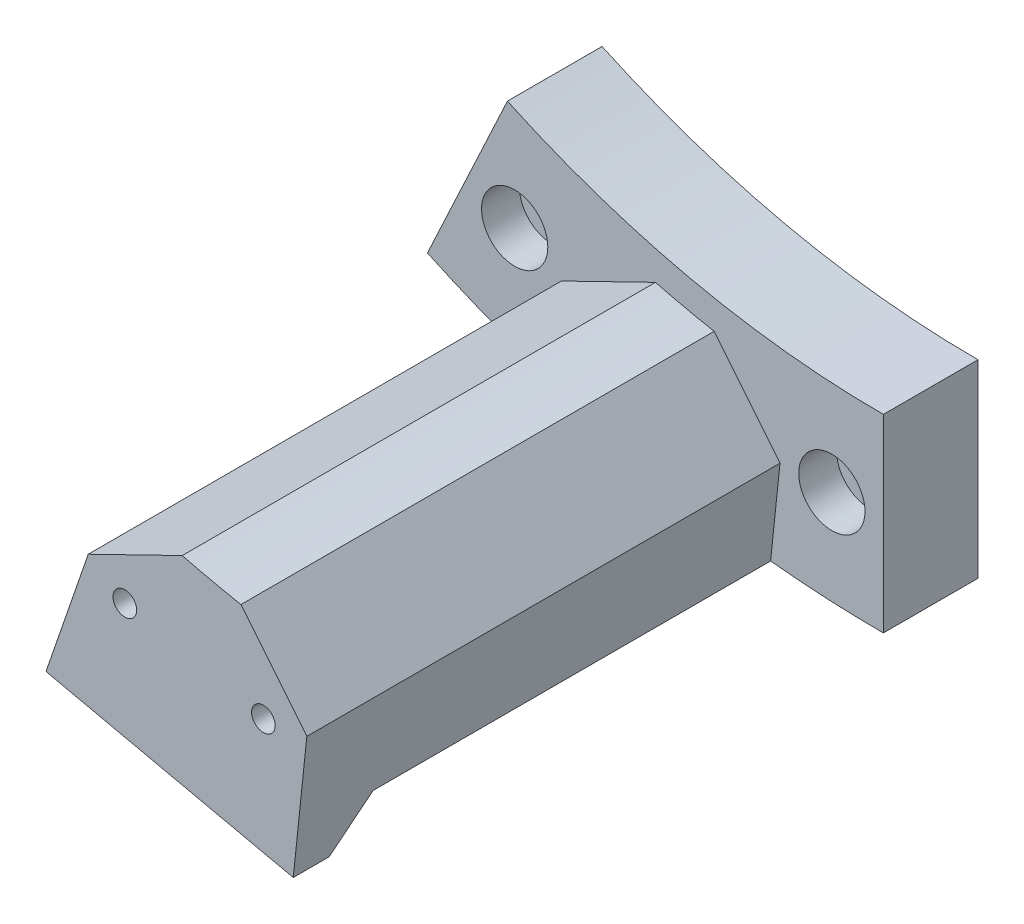
ISO-10303-21;
HEADER;
FILE_DESCRIPTION(('STEP AP214'),'2;1');
FILE_NAME('part.step','',(''),(''),'','','');
FILE_SCHEMA(('AUTOMOTIVE_DESIGN { 1 0 10303 214 1 1 1 1 }'));
ENDSEC;
DATA;
#1=APPLICATION_CONTEXT('core data for automotive mechanical design processes');
#2=APPLICATION_PROTOCOL_DEFINITION('international standard','automotive_design',2000,#1);
#3=PRODUCT_CONTEXT('',#1,'mechanical');
#4=PRODUCT('Part','Part','',(#3));
#5=PRODUCT_RELATED_PRODUCT_CATEGORY('part','',(#4));
#6=PRODUCT_DEFINITION_FORMATION('','',#4);
#7=PRODUCT_DEFINITION_CONTEXT('part definition',#1,'design');
#8=PRODUCT_DEFINITION('design','',#6,#7);
#9=PRODUCT_DEFINITION_SHAPE('','',#8);
#10=(LENGTH_UNIT() NAMED_UNIT(*) SI_UNIT(.MILLI.,.METRE.));
#11=(NAMED_UNIT(*) PLANE_ANGLE_UNIT() SI_UNIT($,.RADIAN.));
#12=(NAMED_UNIT(*) SI_UNIT($,.STERADIAN.) SOLID_ANGLE_UNIT());
#13=UNCERTAINTY_MEASURE_WITH_UNIT(LENGTH_MEASURE(1.E-05),#10,'distance_accuracy_value','');
#14=(GEOMETRIC_REPRESENTATION_CONTEXT(3) GLOBAL_UNCERTAINTY_ASSIGNED_CONTEXT((#13)) GLOBAL_UNIT_ASSIGNED_CONTEXT((#10,
#11,#12)) REPRESENTATION_CONTEXT('',''));
#15=CARTESIAN_POINT('',(0.,0.,0.));
#16=DIRECTION('',(0.,0.,1.));
#17=DIRECTION('',(1.,0.,0.));
#18=AXIS2_PLACEMENT_3D('',#15,#16,#17);
#19=CARTESIAN_POINT('',(-38.9590857152549,-96.4271208749459,-0.000999999999999265));
#20=DIRECTION('',(0.,0.,1.));
#21=DIRECTION('',(1.,0.,0.));
#22=AXIS2_PLACEMENT_3D('',#19,#20,#21);
#23=CYLINDRICAL_SURFACE('',#22,1.75);
#24=CARTESIAN_POINT('',(-38.9590857152549,-96.4271208749459,0.));
#25=DIRECTION('',(0.,0.,-1.));
#26=DIRECTION('',(-1.,0.,0.));
#27=AXIS2_PLACEMENT_3D('',#24,#25,#26);
#28=CIRCLE('',#27,1.75);
#29=CARTESIAN_POINT('',(-40.7090857152549,-96.4271208749459,0.));
#30=VERTEX_POINT('',#29);
#31=EDGE_CURVE('E287',#30,#30,#28,.F.);
#32=ORIENTED_EDGE('',*,*,#31,.F.);
#33=EDGE_LOOP('',(#32));
#34=FACE_BOUND('',#33,.T.);
#35=CARTESIAN_POINT('',(-38.9590857152549,-96.4271208749459,6.));
#36=DIRECTION('',(0.,0.,1.));
#37=DIRECTION('',(1.,0.,0.));
#38=AXIS2_PLACEMENT_3D('',#35,#36,#37);
#39=CIRCLE('',#38,1.75);
#40=CARTESIAN_POINT('',(-37.2090857152549,-96.4271208749459,6.));
#41=VERTEX_POINT('',#40);
#42=EDGE_CURVE('E289',#41,#41,#39,.F.);
#43=ORIENTED_EDGE('',*,*,#42,.F.);
#44=EDGE_LOOP('',(#43));
#45=FACE_BOUND('',#44,.T.);
#46=ADVANCED_FACE('F36',(#34,#45),#23,.F.);
#47=CARTESIAN_POINT('',(-5.44293944926615,-103.857471614476,-0.000999999999999265));
#48=DIRECTION('',(0.,0.,1.));
#49=DIRECTION('',(1.,0.,0.));
#50=AXIS2_PLACEMENT_3D('',#47,#48,#49);
#51=CYLINDRICAL_SURFACE('',#50,1.75);
#52=CARTESIAN_POINT('',(-5.44293944926615,-103.857471614476,0.));
#53=DIRECTION('',(0.,0.,-1.));
#54=DIRECTION('',(-1.,0.,0.));
#55=AXIS2_PLACEMENT_3D('',#52,#53,#54);
#56=CIRCLE('',#55,1.75);
#57=CARTESIAN_POINT('',(-7.19293944926615,-103.857471614476,0.));
#58=VERTEX_POINT('',#57);
#59=EDGE_CURVE('E284',#58,#58,#56,.F.);
#60=ORIENTED_EDGE('',*,*,#59,.F.);
#61=EDGE_LOOP('',(#60));
#62=FACE_BOUND('',#61,.T.);
#63=CARTESIAN_POINT('',(-5.44293944926615,-103.857471614476,6.));
#64=DIRECTION('',(0.,0.,1.));
#65=DIRECTION('',(1.,0.,0.));
#66=AXIS2_PLACEMENT_3D('',#63,#64,#65);
#67=CIRCLE('',#66,1.75);
#68=CARTESIAN_POINT('',(-3.69293944926615,-103.857471614476,6.));
#69=VERTEX_POINT('',#68);
#70=EDGE_CURVE('E273',#69,#69,#67,.F.);
#71=ORIENTED_EDGE('',*,*,#70,.F.);
#72=EDGE_LOOP('',(#71));
#73=FACE_BOUND('',#72,.T.);
#74=ADVANCED_FACE('F239',(#62,#73),#51,.F.);
#75=CARTESIAN_POINT('',(0.,0.,10.));
#76=DIRECTION('',(0.,0.,-1.));
#77=DIRECTION('',(-1.,0.,0.));
#78=AXIS2_PLACEMENT_3D('',#75,#76,#77);
#79=PLANE('',#78);
#80=CARTESIAN_POINT('',(-38.9590857152549,-96.4271208749459,10.));
#81=DIRECTION('',(0.,0.,1.));
#82=DIRECTION('',(1.,0.,0.));
#83=AXIS2_PLACEMENT_3D('',#80,#81,#82);
#84=CIRCLE('',#83,3.5);
#85=CARTESIAN_POINT('',(-35.4590857152549,-96.4271208749459,10.));
#86=VERTEX_POINT('',#85);
#87=EDGE_CURVE('E274',#86,#86,#84,.T.);
#88=ORIENTED_EDGE('',*,*,#87,.F.);
#89=EDGE_LOOP('',(#88));
#90=FACE_BOUND('',#89,.T.);
#91=CARTESIAN_POINT('',(-5.44293944926615,-103.857471614476,10.));
#92=DIRECTION('',(0.,0.,1.));
#93=DIRECTION('',(1.,0.,0.));
#94=AXIS2_PLACEMENT_3D('',#91,#92,#93);
#95=CIRCLE('',#94,3.5);
#96=CARTESIAN_POINT('',(-1.94293944926615,-103.857471614476,10.));
#97=VERTEX_POINT('',#96);
#98=EDGE_CURVE('E280',#97,#97,#95,.T.);
#99=ORIENTED_EDGE('',*,*,#98,.F.);
#100=EDGE_LOOP('',(#99));
#101=FACE_BOUND('',#100,.T.);
#102=DIRECTION('',(-0.325568154457157,-0.945518575599317,0.));
#103=VECTOR('',#102,1.);
#104=CARTESIAN_POINT('',(-31.5801109823442,-91.7153018331337,10.));
#105=LINE('',#104,#103);
#106=CARTESIAN_POINT('',(-34.0218721407729,-98.8066911501286,10.));
#107=VERTEX_POINT('',#106);
#108=CARTESIAN_POINT('',(-37.1147696081159,-107.789117618322,10.));
#109=VERTEX_POINT('',#108);
#110=EDGE_CURVE('E157',#107,#109,#105,.T.);
#111=ORIENTED_EDGE('',*,*,#110,.F.);
#112=DIRECTION('',(-0.898794046299167,-0.438371146789077,0.));
#113=VECTOR('',#112,1.);
#114=CARTESIAN_POINT('',(32.3924095046778,-66.4142816454508,10.));
#115=LINE('',#114,#113);
#116=CARTESIAN_POINT('',(-24.0878755883377,-93.961557296805,10.));
#117=VERTEX_POINT('',#116);
#118=EDGE_CURVE('E11',#107,#117,#115,.F.);
#119=ORIENTED_EDGE('',*,*,#118,.T.);
#120=CARTESIAN_POINT('',(0.,0.,10.));
#121=DIRECTION('',(0.,0.,-1.));
#122=DIRECTION('',(-1.,0.,0.));
#123=AXIS2_PLACEMENT_3D('',#120,#121,#122);
#124=CIRCLE('',#123,97.);
#125=CARTESIAN_POINT('',(-17.8788407963445,-95.3380671703542,10.));
#126=VERTEX_POINT('',#125);
#127=EDGE_CURVE('E154',#126,#117,#124,.T.);
#128=ORIENTED_EDGE('',*,*,#127,.F.);
#129=DIRECTION('',(-0.629320391049836,0.777145961456972,0.));
#130=VECTOR('',#129,1.);
#131=CARTESIAN_POINT('',(-57.4253812387272,-46.5021568272572,10.));
#132=LINE('',#131,#130);
#133=CARTESIAN_POINT('',(-10.9232244114698,-103.927538065985,10.));
#134=VERTEX_POINT('',#133);
#135=EDGE_CURVE('E45',#126,#134,#132,.F.);
#136=ORIENTED_EDGE('',*,*,#135,.T.);
#137=DIRECTION('',(0.104528463267654,0.994521895368273,0.));
#138=VECTOR('',#137,1.);
#139=CARTESIAN_POINT('',(-10.1392609369624,-96.4686238507225,10.));
#140=LINE('',#139,#138);
#141=CARTESIAN_POINT('',(-11.9162448125125,-113.375496071983,10.));
#142=VERTEX_POINT('',#141);
#143=EDGE_CURVE('E141',#142,#134,#140,.T.);
#144=ORIENTED_EDGE('',*,*,#143,.F.);
#145=CARTESIAN_POINT('',(0.,0.,10.));
#146=DIRECTION('',(0.,0.,1.));
#147=DIRECTION('',(-1.,0.,0.));
#148=AXIS2_PLACEMENT_3D('',#145,#146,#147);
#149=CIRCLE('',#148,114.);
#150=CARTESIAN_POINT('',(0.,-114.,10.));
#151=VERTEX_POINT('',#150);
#152=EDGE_CURVE('E169',#142,#151,#149,.T.);
#153=ORIENTED_EDGE('',*,*,#152,.T.);
#154=DIRECTION('',(0.,1.,0.));
#155=VECTOR('',#154,1.);
#156=CARTESIAN_POINT('',(0.,-94.,10.));
#157=LINE('',#156,#155);
#158=CARTESIAN_POINT('',(0.,-94.,10.));
#159=VERTEX_POINT('',#158);
#160=EDGE_CURVE('E168',#151,#159,#157,.T.);
#161=ORIENTED_EDGE('',*,*,#160,.T.);
#162=CARTESIAN_POINT('',(0.,0.,10.));
#163=DIRECTION('',(0.,0.,-1.));
#164=DIRECTION('',(-1.,0.,0.));
#165=AXIS2_PLACEMENT_3D('',#162,#163,#164);
#166=CIRCLE('',#165,94.);
#167=CARTESIAN_POINT('',(-39.7261166036258,-85.1929319814451,10.));
#168=VERTEX_POINT('',#167);
#169=EDGE_CURVE('E171',#159,#168,#166,.T.);
#170=ORIENTED_EDGE('',*,*,#169,.T.);
#171=DIRECTION('',(-0.4226182617407,-0.90630778703665,0.));
#172=VECTOR('',#171,1.);
#173=CARTESIAN_POINT('',(-39.7261166036258,-85.1929319814451,10.));
#174=LINE('',#173,#172);
#175=CARTESIAN_POINT('',(-48.1784818384398,-103.319087722178,10.));
#176=VERTEX_POINT('',#175);
#177=EDGE_CURVE('E173',#168,#176,#174,.T.);
#178=ORIENTED_EDGE('',*,*,#177,.T.);
#179=EDGE_CURVE('E165',#176,#109,#149,.T.);
#180=ORIENTED_EDGE('',*,*,#179,.T.);
#181=EDGE_LOOP('',(#111,#119,#128,#136,#144,#153,#161,#170,#178,#180));
#182=FACE_BOUND('',#181,.T.);
#183=ADVANCED_FACE('F245',(#90,#101,#182),#79,.F.);
#184=CARTESIAN_POINT('',(0.,0.,10.));
#185=DIRECTION('',(0.,0.,-1.));
#186=DIRECTION('',(-1.,0.,0.));
#187=AXIS2_PLACEMENT_3D('',#184,#185,#186);
#188=CYLINDRICAL_SURFACE('',#187,114.);
#189=DIRECTION('',(0.,0.,-1.));
#190=VECTOR('',#189,1.);
#191=CARTESIAN_POINT('',(-11.9162448125125,-113.375496071983,58.));
#192=LINE('',#191,#190);
#193=CARTESIAN_POINT('',(-11.9162448125125,-113.375496071983,52.));
#194=VERTEX_POINT('',#193);
#195=EDGE_CURVE('E162',#194,#142,#192,.T.);
#196=ORIENTED_EDGE('',*,*,#195,.F.);
#197=CARTESIAN_POINT('',(0.,0.,52.));
#198=DIRECTION('',(0.,0.,1.));
#199=DIRECTION('',(1.,0.,0.));
#200=AXIS2_PLACEMENT_3D('',#197,#198,#199);
#201=CIRCLE('',#200,114.);
#202=CARTESIAN_POINT('',(-37.1147696081159,-107.789117618322,52.));
#203=VERTEX_POINT('',#202);
#204=EDGE_CURVE('E195',#194,#203,#201,.F.);
#205=ORIENTED_EDGE('',*,*,#204,.T.);
#206=DIRECTION('',(0.,0.,-1.));
#207=VECTOR('',#206,1.);
#208=CARTESIAN_POINT('',(-37.1147696081159,-107.789117618322,58.));
#209=LINE('',#208,#207);
#210=EDGE_CURVE('E159',#203,#109,#209,.T.);
#211=ORIENTED_EDGE('',*,*,#210,.T.);
#212=ORIENTED_EDGE('',*,*,#179,.F.);
#213=DIRECTION('',(0.,0.,-1.));
#214=VECTOR('',#213,1.);
#215=CARTESIAN_POINT('',(-48.1784818384398,-103.319087722178,10.));
#216=LINE('',#215,#214);
#217=CARTESIAN_POINT('',(-48.1784818384398,-103.319087722178,0.));
#218=VERTEX_POINT('',#217);
#219=EDGE_CURVE('E175',#176,#218,#216,.T.);
#220=ORIENTED_EDGE('',*,*,#219,.T.);
#221=CARTESIAN_POINT('',(0.,0.,0.));
#222=DIRECTION('',(0.,0.,1.));
#223=DIRECTION('',(-1.,0.,0.));
#224=AXIS2_PLACEMENT_3D('',#221,#222,#223);
#225=CIRCLE('',#224,114.);
#226=CARTESIAN_POINT('',(0.,-114.,0.));
#227=VERTEX_POINT('',#226);
#228=EDGE_CURVE('E164',#218,#227,#225,.T.);
#229=ORIENTED_EDGE('',*,*,#228,.T.);
#230=DIRECTION('',(0.,0.,-1.));
#231=VECTOR('',#230,1.);
#232=CARTESIAN_POINT('',(0.,-114.,10.));
#233=LINE('',#232,#231);
#234=EDGE_CURVE('E192',#151,#227,#233,.T.);
#235=ORIENTED_EDGE('',*,*,#234,.F.);
#236=ORIENTED_EDGE('',*,*,#152,.F.);
#237=EDGE_LOOP('',(#196,#205,#211,#212,#220,#229,#235,#236));
#238=FACE_BOUND('',#237,.T.);
#239=ADVANCED_FACE('F221',(#238),#188,.T.);
#240=CARTESIAN_POINT('',(0.,-94.,10.));
#241=DIRECTION('',(-1.,0.,0.));
#242=DIRECTION('',(0.,-1.,0.));
#243=AXIS2_PLACEMENT_3D('',#240,#241,#242);
#244=PLANE('',#243);
#245=DIRECTION('',(0.,1.,0.));
#246=VECTOR('',#245,1.);
#247=CARTESIAN_POINT('',(0.,-94.,0.));
#248=LINE('',#247,#246);
#249=CARTESIAN_POINT('',(0.,-94.,0.));
#250=VERTEX_POINT('',#249);
#251=EDGE_CURVE('E178',#227,#250,#248,.T.);
#252=ORIENTED_EDGE('',*,*,#251,.T.);
#253=DIRECTION('',(0.,0.,-1.));
#254=VECTOR('',#253,1.);
#255=CARTESIAN_POINT('',(0.,-94.,10.));
#256=LINE('',#255,#254);
#257=EDGE_CURVE('E189',#159,#250,#256,.T.);
#258=ORIENTED_EDGE('',*,*,#257,.F.);
#259=ORIENTED_EDGE('',*,*,#160,.F.);
#260=ORIENTED_EDGE('',*,*,#234,.T.);
#261=EDGE_LOOP('',(#252,#258,#259,#260));
#262=FACE_BOUND('',#261,.T.);
#263=ADVANCED_FACE('F325',(#262),#244,.F.);
#264=CARTESIAN_POINT('',(0.,0.,10.));
#265=DIRECTION('',(0.,0.,-1.));
#266=DIRECTION('',(-1.,0.,0.));
#267=AXIS2_PLACEMENT_3D('',#264,#265,#266);
#268=CYLINDRICAL_SURFACE('',#267,94.);
#269=CARTESIAN_POINT('',(0.,0.,0.));
#270=DIRECTION('',(0.,0.,-1.));
#271=DIRECTION('',(-1.,0.,0.));
#272=AXIS2_PLACEMENT_3D('',#269,#270,#271);
#273=CIRCLE('',#272,94.);
#274=CARTESIAN_POINT('',(-39.7261166036258,-85.1929319814451,0.));
#275=VERTEX_POINT('',#274);
#276=EDGE_CURVE('E180',#250,#275,#273,.T.);
#277=ORIENTED_EDGE('',*,*,#276,.T.);
#278=DIRECTION('',(0.,0.,-1.));
#279=VECTOR('',#278,1.);
#280=CARTESIAN_POINT('',(-39.7261166036258,-85.1929319814451,10.));
#281=LINE('',#280,#279);
#282=EDGE_CURVE('E186',#168,#275,#281,.T.);
#283=ORIENTED_EDGE('',*,*,#282,.F.);
#284=ORIENTED_EDGE('',*,*,#169,.F.);
#285=ORIENTED_EDGE('',*,*,#257,.T.);
#286=EDGE_LOOP('',(#277,#283,#284,#285));
#287=FACE_BOUND('',#286,.T.);
#288=ADVANCED_FACE('F330',(#287),#268,.F.);
#289=CARTESIAN_POINT('',(-39.7261166036258,-85.1929319814451,10.));
#290=DIRECTION('',(0.90630778703665,-0.4226182617407,0.));
#291=DIRECTION('',(0.4226182617407,0.90630778703665,0.));
#292=AXIS2_PLACEMENT_3D('',#289,#290,#291);
#293=PLANE('',#292);
#294=DIRECTION('',(-0.4226182617407,-0.90630778703665,0.));
#295=VECTOR('',#294,1.);
#296=CARTESIAN_POINT('',(-39.7261166036258,-85.1929319814451,0.));
#297=LINE('',#296,#295);
#298=EDGE_CURVE('E182',#275,#218,#297,.T.);
#299=ORIENTED_EDGE('',*,*,#298,.T.);
#300=ORIENTED_EDGE('',*,*,#219,.F.);
#301=ORIENTED_EDGE('',*,*,#177,.F.);
#302=ORIENTED_EDGE('',*,*,#282,.T.);
#303=EDGE_LOOP('',(#299,#300,#301,#302));
#304=FACE_BOUND('',#303,.T.);
#305=ADVANCED_FACE('F335',(#304),#293,.F.);
#306=CARTESIAN_POINT('',(0.,0.,0.));
#307=DIRECTION('',(0.,0.,-1.));
#308=DIRECTION('',(-1.,0.,0.));
#309=AXIS2_PLACEMENT_3D('',#306,#307,#308);
#310=PLANE('',#309);
#311=ORIENTED_EDGE('',*,*,#59,.T.);
#312=EDGE_LOOP('',(#311));
#313=FACE_BOUND('',#312,.T.);
#314=ORIENTED_EDGE('',*,*,#31,.T.);
#315=EDGE_LOOP('',(#314));
#316=FACE_BOUND('',#315,.T.);
#317=ORIENTED_EDGE('',*,*,#228,.F.);
#318=ORIENTED_EDGE('',*,*,#298,.F.);
#319=ORIENTED_EDGE('',*,*,#276,.F.);
#320=ORIENTED_EDGE('',*,*,#251,.F.);
#321=EDGE_LOOP('',(#317,#318,#319,#320));
#322=FACE_BOUND('',#321,.T.);
#323=ADVANCED_FACE('F345',(#313,#316,#322),#310,.T.);
#324=CARTESIAN_POINT('',(-10.1392609369624,-96.4686238507225,58.));
#325=DIRECTION('',(-0.994521895368273,0.104528463267654,0.));
#326=DIRECTION('',(-0.104528463267654,-0.994521895368273,0.));
#327=AXIS2_PLACEMENT_3D('',#324,#325,#326);
#328=PLANE('',#327);
#329=ORIENTED_EDGE('',*,*,#143,.T.);
#330=DIRECTION('',(0.,0.,1.));
#331=VECTOR('',#330,1.);
#332=CARTESIAN_POINT('',(-10.9232244114698,-103.927538065985,58.));
#333=LINE('',#332,#331);
#334=CARTESIAN_POINT('',(-10.9232244114698,-103.927538065985,60.));
#335=VERTEX_POINT('',#334);
#336=EDGE_CURVE('E297',#134,#335,#333,.T.);
#337=ORIENTED_EDGE('',*,*,#336,.T.);
#338=DIRECTION('',(0.104528463267655,0.994521895368273,0.));
#339=VECTOR('',#338,1.);
#340=CARTESIAN_POINT('',(-12.3562960651958,-117.562304068549,60.));
#341=LINE('',#340,#339);
#342=CARTESIAN_POINT('',(-12.3562960651958,-117.562304068549,60.));
#343=VERTEX_POINT('',#342);
#344=EDGE_CURVE('E146',#343,#335,#341,.T.);
#345=ORIENTED_EDGE('',*,*,#344,.F.);
#346=DIRECTION('',(0.,0.,-1.));
#347=VECTOR('',#346,1.);
#348=CARTESIAN_POINT('',(-12.3562960651958,-117.562304068549,60.));
#349=LINE('',#348,#347);
#350=CARTESIAN_POINT('',(-12.3562960651958,-117.562304068549,56.2098701054899));
#351=VERTEX_POINT('',#350);
#352=EDGE_CURVE('E142',#343,#351,#349,.T.);
#353=ORIENTED_EDGE('',*,*,#352,.T.);
#354=DIRECTION('',(-0.0739127852035671,-0.703233176253408,0.707106781186544));
#355=VECTOR('',#354,1.);
#356=CARTESIAN_POINT('',(0.,0.,-61.9999999999989));
#357=LINE('',#356,#355);
#358=EDGE_CURVE('E206',#351,#194,#357,.F.);
#359=ORIENTED_EDGE('',*,*,#358,.T.);
#360=ORIENTED_EDGE('',*,*,#195,.T.);
#361=EDGE_LOOP('',(#329,#337,#345,#353,#359,#360));
#362=FACE_BOUND('',#361,.T.);
#363=ADVANCED_FACE('F311',(#362),#328,.F.);
#364=CARTESIAN_POINT('',(0.,0.,58.));
#365=DIRECTION('',(0.,0.,-1.));
#366=DIRECTION('',(-1.,0.,0.));
#367=AXIS2_PLACEMENT_3D('',#364,#365,#366);
#368=CYLINDRICAL_SURFACE('',#367,97.);
#369=CARTESIAN_POINT('',(0.,0.,60.));
#370=DIRECTION('',(0.,0.,-1.));
#371=DIRECTION('',(1.,0.,0.));
#372=AXIS2_PLACEMENT_3D('',#369,#370,#371);
#373=CIRCLE('',#372,97.);
#374=CARTESIAN_POINT('',(-17.8788407963445,-95.3380671703542,60.));
#375=VERTEX_POINT('',#374);
#376=CARTESIAN_POINT('',(-24.0878755883377,-93.961557296805,60.));
#377=VERTEX_POINT('',#376);
#378=EDGE_CURVE('E131',#375,#377,#373,.T.);
#379=ORIENTED_EDGE('',*,*,#378,.F.);
#380=DIRECTION('',(0.,0.,-1.));
#381=VECTOR('',#380,1.);
#382=CARTESIAN_POINT('',(-17.8788407963445,-95.3380671703542,58.));
#383=LINE('',#382,#381);
#384=EDGE_CURVE('E300',#375,#126,#383,.T.);
#385=ORIENTED_EDGE('',*,*,#384,.T.);
#386=ORIENTED_EDGE('',*,*,#127,.T.);
#387=DIRECTION('',(0.,0.,-1.));
#388=VECTOR('',#387,1.);
#389=CARTESIAN_POINT('',(-24.0878755883377,-93.961557296805,58.));
#390=LINE('',#389,#388);
#391=EDGE_CURVE('E295',#117,#377,#390,.F.);
#392=ORIENTED_EDGE('',*,*,#391,.T.);
#393=EDGE_LOOP('',(#379,#385,#386,#392));
#394=FACE_BOUND('',#393,.T.);
#395=ADVANCED_FACE('F338',(#394),#368,.F.);
#396=CARTESIAN_POINT('',(-31.5801109823442,-91.7153018331337,58.));
#397=DIRECTION('',(0.945518575599317,-0.325568154457157,0.));
#398=DIRECTION('',(0.325568154457157,0.945518575599317,0.));
#399=AXIS2_PLACEMENT_3D('',#396,#397,#398);
#400=PLANE('',#399);
#401=DIRECTION('',(-0.325568154457156,-0.945518575599317,0.));
#402=VECTOR('',#401,1.);
#403=CARTESIAN_POINT('',(-31.5801109823442,-91.7153018331337,60.));
#404=LINE('',#403,#402);
#405=CARTESIAN_POINT('',(-34.0218721407729,-98.8066911501286,60.));
#406=VERTEX_POINT('',#405);
#407=CARTESIAN_POINT('',(-38.4853692488646,-111.769628003923,60.));
#408=VERTEX_POINT('',#407);
#409=EDGE_CURVE('E123',#406,#408,#404,.T.);
#410=ORIENTED_EDGE('',*,*,#409,.F.);
#411=DIRECTION('',(0.,0.,-1.));
#412=VECTOR('',#411,1.);
#413=CARTESIAN_POINT('',(-34.0218721407729,-98.8066911501286,58.));
#414=LINE('',#413,#412);
#415=EDGE_CURVE('E296',#406,#107,#414,.T.);
#416=ORIENTED_EDGE('',*,*,#415,.T.);
#417=ORIENTED_EDGE('',*,*,#110,.T.);
#418=ORIENTED_EDGE('',*,*,#210,.F.);
#419=DIRECTION('',(0.230211449755046,0.668582596544126,-0.707106781186544));
#420=VECTOR('',#419,1.);
#421=CARTESIAN_POINT('',(0.,0.,-61.9999999999989));
#422=LINE('',#421,#420);
#423=CARTESIAN_POINT('',(-38.4853692488646,-111.769628003923,56.2098701054899));
#424=VERTEX_POINT('',#423);
#425=EDGE_CURVE('E137',#203,#424,#422,.F.);
#426=ORIENTED_EDGE('',*,*,#425,.T.);
#427=DIRECTION('',(0.,0.,-1.));
#428=VECTOR('',#427,1.);
#429=CARTESIAN_POINT('',(-38.4853692488646,-111.769628003923,60.));
#430=LINE('',#429,#428);
#431=EDGE_CURVE('E134',#408,#424,#430,.T.);
#432=ORIENTED_EDGE('',*,*,#431,.F.);
#433=EDGE_LOOP('',(#410,#416,#417,#418,#426,#432));
#434=FACE_BOUND('',#433,.T.);
#435=ADVANCED_FACE('F135',(#434),#400,.F.);
#436=CARTESIAN_POINT('',(-38.4853692488646,-111.769628003923,60.));
#437=DIRECTION('',(0.216439613938104,0.976296007119933,0.));
#438=DIRECTION('',(-0.976296007119933,0.216439613938104,0.));
#439=AXIS2_PLACEMENT_3D('',#436,#437,#438);
#440=PLANE('',#439);
#441=ORIENTED_EDGE('',*,*,#431,.T.);
#442=CARTESIAN_POINT('',(-38.4853692488646,-111.769628003923,56.2098701054899));
#443=CARTESIAN_POINT('',(-37.3995322650124,-112.010352267743,56.0839358952391));
#444=CARTESIAN_POINT('',(-36.3119852357571,-112.251455639503,55.9733565928059));
#445=CARTESIAN_POINT('',(-34.1342777567247,-112.734241764402,55.7833824540378));
#446=CARTESIAN_POINT('',(-33.044117254268,-112.97592452922,55.7039882517072));
#447=CARTESIAN_POINT('',(-30.865534022812,-113.458904803758,55.5770680441009));
#448=CARTESIAN_POINT('',(-29.7771169393486,-113.700201061891,55.5294406156543));
#449=CARTESIAN_POINT('',(-27.5994107835805,-114.182986893429,55.4659067557714));
#450=CARTESIAN_POINT('',(-26.5101217203053,-114.424476464833,55.45));
#451=CARTESIAN_POINT('',(-24.3315435937551,-114.90745560764,55.45));
#452=CARTESIAN_POINT('',(-23.24225453048,-115.148945179043,55.4659067557714));
#453=CARTESIAN_POINT('',(-21.0645483747118,-115.631731010582,55.5294406156543));
#454=CARTESIAN_POINT('',(-19.9761312912485,-115.873027268715,55.5770680441009));
#455=CARTESIAN_POINT('',(-17.7975480597924,-116.356007543252,55.7039882517072));
#456=CARTESIAN_POINT('',(-16.7073875573357,-116.597690308071,55.7833824540378));
#457=CARTESIAN_POINT('',(-14.5296800783033,-117.08047643297,55.9733565928059));
#458=CARTESIAN_POINT('',(-13.442133049048,-117.321579804729,56.0839358952391));
#459=CARTESIAN_POINT('',(-12.3562960651958,-117.562304068549,56.2098701054899));
#460=B_SPLINE_CURVE_WITH_KNOTS('',3,(#442,#443,#444,#445,#446,#447,#448,#449,#450,#451,#452,
#453,#454,#455,#456,#457,#458,#459),.UNSPECIFIED.,.F.,.F.,(4,2,2,2,2,2,2,2,4),(0.,
3.35783554817279,6.71573935880137,10.0628702578632,13.40996693327,16.7570636086768,
20.1041945077386,23.4620983183672,26.81993386654),.UNSPECIFIED.);
#461=EDGE_CURVE('E198',#424,#351,#460,.T.);
#462=ORIENTED_EDGE('',*,*,#461,.T.);
#463=ORIENTED_EDGE('',*,*,#352,.F.);
#464=DIRECTION('',(0.976296007119933,-0.216439613938104,0.));
#465=VECTOR('',#464,1.);
#466=CARTESIAN_POINT('',(-38.4853692488646,-111.769628003923,60.));
#467=LINE('',#466,#465);
#468=EDGE_CURVE('E128',#408,#343,#467,.T.);
#469=ORIENTED_EDGE('',*,*,#468,.F.);
#470=EDGE_LOOP('',(#441,#462,#463,#469));
#471=FACE_BOUND('',#470,.T.);
#472=ADVANCED_FACE('F144',(#471),#440,.F.);
#473=CARTESIAN_POINT('',(0.,0.,60.));
#474=DIRECTION('',(0.,0.,1.));
#475=DIRECTION('',(1.,0.,0.));
#476=AXIS2_PLACEMENT_3D('',#473,#474,#475);
#477=PLANE('',#476);
#478=CARTESIAN_POINT('',(-30.1565993238694,-101.375931646617,60.));
#479=DIRECTION('',(0.,0.,1.));
#480=DIRECTION('',(1.,0.,0.));
#481=AXIS2_PLACEMENT_3D('',#478,#479,#480);
#482=CIRCLE('',#481,1.25);
#483=CARTESIAN_POINT('',(-28.9065993238694,-101.375931646617,60.));
#484=VERTEX_POINT('',#483);
#485=EDGE_CURVE('E259',#484,#484,#482,.T.);
#486=ORIENTED_EDGE('',*,*,#485,.F.);
#487=EDGE_LOOP('',(#486));
#488=FACE_BOUND('',#487,.T.);
#489=CARTESIAN_POINT('',(-15.5121592170704,-104.622525855689,60.));
#490=DIRECTION('',(0.,0.,1.));
#491=DIRECTION('',(1.,0.,0.));
#492=AXIS2_PLACEMENT_3D('',#489,#490,#491);
#493=CIRCLE('',#492,1.25);
#494=CARTESIAN_POINT('',(-14.2621592170704,-104.622525855689,60.));
#495=VERTEX_POINT('',#494);
#496=EDGE_CURVE('E262',#495,#495,#493,.T.);
#497=ORIENTED_EDGE('',*,*,#496,.F.);
#498=EDGE_LOOP('',(#497));
#499=FACE_BOUND('',#498,.T.);
#500=ORIENTED_EDGE('',*,*,#344,.T.);
#501=DIRECTION('',(0.629320391049836,-0.777145961456972,0.));
#502=VECTOR('',#501,1.);
#503=CARTESIAN_POINT('',(-57.4253812387272,-46.5021568272572,60.));
#504=LINE('',#503,#502);
#505=EDGE_CURVE('E291',#335,#375,#504,.F.);
#506=ORIENTED_EDGE('',*,*,#505,.T.);
#507=ORIENTED_EDGE('',*,*,#378,.T.);
#508=DIRECTION('',(0.898794046299167,0.438371146789077,0.));
#509=VECTOR('',#508,1.);
#510=CARTESIAN_POINT('',(32.3924095046778,-66.4142816454508,60.));
#511=LINE('',#510,#509);
#512=EDGE_CURVE('E58',#377,#406,#511,.F.);
#513=ORIENTED_EDGE('',*,*,#512,.T.);
#514=ORIENTED_EDGE('',*,*,#409,.T.);
#515=ORIENTED_EDGE('',*,*,#468,.T.);
#516=EDGE_LOOP('',(#500,#506,#507,#513,#514,#515));
#517=FACE_BOUND('',#516,.T.);
#518=ADVANCED_FACE('F126',(#488,#499,#517),#477,.T.);
#519=CARTESIAN_POINT('',(0.,0.,58.));
#520=DIRECTION('',(0.,0.,1.));
#521=DIRECTION('',(1.,0.,0.));
#522=AXIS2_PLACEMENT_3D('',#519,#520,#521);
#523=CONICAL_SURFACE('',#522,120.,0.785398163397453);
#524=ORIENTED_EDGE('',*,*,#425,.F.);
#525=ORIENTED_EDGE('',*,*,#204,.F.);
#526=ORIENTED_EDGE('',*,*,#358,.F.);
#527=ORIENTED_EDGE('',*,*,#461,.F.);
#528=EDGE_LOOP('',(#524,#525,#526,#527));
#529=FACE_BOUND('',#528,.T.);
#530=ADVANCED_FACE('F212',(#529),#523,.T.);
#531=CARTESIAN_POINT('',(-5.44293944926615,-103.857471614476,6.));
#532=DIRECTION('',(0.,0.,1.));
#533=DIRECTION('',(1.,0.,0.));
#534=AXIS2_PLACEMENT_3D('',#531,#532,#533);
#535=PLANE('',#534);
#536=CARTESIAN_POINT('',(-5.44293944926615,-103.857471614476,6.));
#537=DIRECTION('',(0.,0.,1.));
#538=DIRECTION('',(1.,0.,0.));
#539=AXIS2_PLACEMENT_3D('',#536,#537,#538);
#540=CIRCLE('',#539,3.5);
#541=CARTESIAN_POINT('',(-1.94293944926615,-103.857471614476,6.));
#542=VERTEX_POINT('',#541);
#543=EDGE_CURVE('E277',#542,#542,#540,.T.);
#544=ORIENTED_EDGE('',*,*,#543,.T.);
#545=EDGE_LOOP('',(#544));
#546=FACE_BOUND('',#545,.T.);
#547=ORIENTED_EDGE('',*,*,#70,.T.);
#548=EDGE_LOOP('',(#547));
#549=FACE_BOUND('',#548,.T.);
#550=ADVANCED_FACE('F219',(#546,#549),#535,.T.);
#551=CARTESIAN_POINT('',(-5.44293944926615,-103.857471614476,6.));
#552=DIRECTION('',(0.,0.,1.));
#553=DIRECTION('',(1.,0.,0.));
#554=AXIS2_PLACEMENT_3D('',#551,#552,#553);
#555=CYLINDRICAL_SURFACE('',#554,3.5);
#556=ORIENTED_EDGE('',*,*,#543,.F.);
#557=EDGE_LOOP('',(#556));
#558=FACE_BOUND('',#557,.T.);
#559=ORIENTED_EDGE('',*,*,#98,.T.);
#560=EDGE_LOOP('',(#559));
#561=FACE_BOUND('',#560,.T.);
#562=ADVANCED_FACE('F388',(#558,#561),#555,.F.);
#563=CARTESIAN_POINT('',(-38.9590857152549,-96.4271208749459,6.));
#564=DIRECTION('',(0.,0.,1.));
#565=DIRECTION('',(1.,0.,0.));
#566=AXIS2_PLACEMENT_3D('',#563,#564,#565);
#567=PLANE('',#566);
#568=CARTESIAN_POINT('',(-38.9590857152549,-96.4271208749459,6.));
#569=DIRECTION('',(0.,0.,1.));
#570=DIRECTION('',(1.,0.,0.));
#571=AXIS2_PLACEMENT_3D('',#568,#569,#570);
#572=CIRCLE('',#571,3.5);
#573=CARTESIAN_POINT('',(-35.4590857152549,-96.4271208749459,6.));
#574=VERTEX_POINT('',#573);
#575=EDGE_CURVE('E270',#574,#574,#572,.T.);
#576=ORIENTED_EDGE('',*,*,#575,.T.);
#577=EDGE_LOOP('',(#576));
#578=FACE_BOUND('',#577,.T.);
#579=ORIENTED_EDGE('',*,*,#42,.T.);
#580=EDGE_LOOP('',(#579));
#581=FACE_BOUND('',#580,.T.);
#582=ADVANCED_FACE('F234',(#578,#581),#567,.T.);
#583=CARTESIAN_POINT('',(-38.9590857152549,-96.4271208749459,6.));
#584=DIRECTION('',(0.,0.,1.));
#585=DIRECTION('',(1.,0.,0.));
#586=AXIS2_PLACEMENT_3D('',#583,#584,#585);
#587=CYLINDRICAL_SURFACE('',#586,3.5);
#588=ORIENTED_EDGE('',*,*,#575,.F.);
#589=EDGE_LOOP('',(#588));
#590=FACE_BOUND('',#589,.T.);
#591=ORIENTED_EDGE('',*,*,#87,.T.);
#592=EDGE_LOOP('',(#591));
#593=FACE_BOUND('',#592,.T.);
#594=ADVANCED_FACE('F227',(#590,#593),#587,.F.);
#595=CARTESIAN_POINT('',(-17.8788407963445,-95.3380671703542,58.));
#596=DIRECTION('',(-0.777145961456972,-0.629320391049836,0.));
#597=DIRECTION('',(0.,0.,-1.));
#598=AXIS2_PLACEMENT_3D('',#595,#596,#597);
#599=PLANE('',#598);
#600=ORIENTED_EDGE('',*,*,#505,.F.);
#601=ORIENTED_EDGE('',*,*,#336,.F.);
#602=ORIENTED_EDGE('',*,*,#135,.F.);
#603=ORIENTED_EDGE('',*,*,#384,.F.);
#604=EDGE_LOOP('',(#600,#601,#602,#603));
#605=FACE_BOUND('',#604,.T.);
#606=ADVANCED_FACE('F223',(#605),#599,.F.);
#607=CARTESIAN_POINT('',(-34.0218721407729,-98.8066911501286,58.));
#608=DIRECTION('',(0.438371146789077,-0.898794046299167,0.));
#609=DIRECTION('',(0.,0.,-1.));
#610=AXIS2_PLACEMENT_3D('',#607,#608,#609);
#611=PLANE('',#610);
#612=ORIENTED_EDGE('',*,*,#512,.F.);
#613=ORIENTED_EDGE('',*,*,#391,.F.);
#614=ORIENTED_EDGE('',*,*,#118,.F.);
#615=ORIENTED_EDGE('',*,*,#415,.F.);
#616=EDGE_LOOP('',(#612,#613,#614,#615));
#617=FACE_BOUND('',#616,.T.);
#618=ADVANCED_FACE('F39',(#617),#611,.F.);
#619=CARTESIAN_POINT('',(-15.5121592170704,-104.622525855689,50.));
#620=DIRECTION('',(0.,0.,1.));
#621=DIRECTION('',(1.,0.,0.));
#622=AXIS2_PLACEMENT_3D('',#619,#620,#621);
#623=CYLINDRICAL_SURFACE('',#622,1.25);
#624=CARTESIAN_POINT('',(-15.5121592170704,-104.622525855689,50.));
#625=DIRECTION('',(0.,0.,1.));
#626=DIRECTION('',(1.,0.,0.));
#627=AXIS2_PLACEMENT_3D('',#624,#625,#626);
#628=CIRCLE('',#627,1.25);
#629=CARTESIAN_POINT('',(-14.2621592170704,-104.622525855689,50.));
#630=VERTEX_POINT('',#629);
#631=EDGE_CURVE('E264',#630,#630,#628,.T.);
#632=ORIENTED_EDGE('',*,*,#631,.F.);
#633=EDGE_LOOP('',(#632));
#634=FACE_BOUND('',#633,.T.);
#635=ORIENTED_EDGE('',*,*,#496,.T.);
#636=EDGE_LOOP('',(#635));
#637=FACE_BOUND('',#636,.T.);
#638=ADVANCED_FACE('F233',(#634,#637),#623,.F.);
#639=CARTESIAN_POINT('',(-15.5121592170704,-104.622525855689,50.));
#640=DIRECTION('',(0.,0.,1.));
#641=DIRECTION('',(1.,0.,0.));
#642=AXIS2_PLACEMENT_3D('',#639,#640,#641);
#643=PLANE('',#642);
#644=ORIENTED_EDGE('',*,*,#631,.T.);
#645=EDGE_LOOP('',(#644));
#646=FACE_BOUND('',#645,.T.);
#647=ADVANCED_FACE('F431',(#646),#643,.T.);
#648=CARTESIAN_POINT('',(-30.1565993238694,-101.375931646617,50.));
#649=DIRECTION('',(0.,0.,1.));
#650=DIRECTION('',(1.,0.,0.));
#651=AXIS2_PLACEMENT_3D('',#648,#649,#650);
#652=CYLINDRICAL_SURFACE('',#651,1.25);
#653=CARTESIAN_POINT('',(-30.1565993238694,-101.375931646617,50.));
#654=DIRECTION('',(0.,0.,1.));
#655=DIRECTION('',(1.,0.,0.));
#656=AXIS2_PLACEMENT_3D('',#653,#654,#655);
#657=CIRCLE('',#656,1.25);
#658=CARTESIAN_POINT('',(-28.9065993238694,-101.375931646617,50.));
#659=VERTEX_POINT('',#658);
#660=EDGE_CURVE('E283',#659,#659,#657,.T.);
#661=ORIENTED_EDGE('',*,*,#660,.F.);
#662=EDGE_LOOP('',(#661));
#663=FACE_BOUND('',#662,.T.);
#664=ORIENTED_EDGE('',*,*,#485,.T.);
#665=EDGE_LOOP('',(#664));
#666=FACE_BOUND('',#665,.T.);
#667=ADVANCED_FACE('F440',(#663,#666),#652,.F.);
#668=CARTESIAN_POINT('',(-30.1565993238694,-101.375931646617,50.));
#669=DIRECTION('',(0.,0.,1.));
#670=DIRECTION('',(1.,0.,0.));
#671=AXIS2_PLACEMENT_3D('',#668,#669,#670);
#672=PLANE('',#671);
#673=ORIENTED_EDGE('',*,*,#660,.T.);
#674=EDGE_LOOP('',(#673));
#675=FACE_BOUND('',#674,.T.);
#676=ADVANCED_FACE('F449',(#675),#672,.T.);
#677=CLOSED_SHELL('',(#46,#74,#183,#239,#263,#288,#305,#323,#363,#395,#435,#472,#518,#530,#550,
#562,#582,#594,#606,#618,#638,#647,#667,#676));
#678=MANIFOLD_SOLID_BREP('B2',#677);
#679=ADVANCED_BREP_SHAPE_REPRESENTATION('',(#18,#678),#14);
#680=SHAPE_DEFINITION_REPRESENTATION(#9,#679);
ENDSEC;
END-ISO-10303-21;
